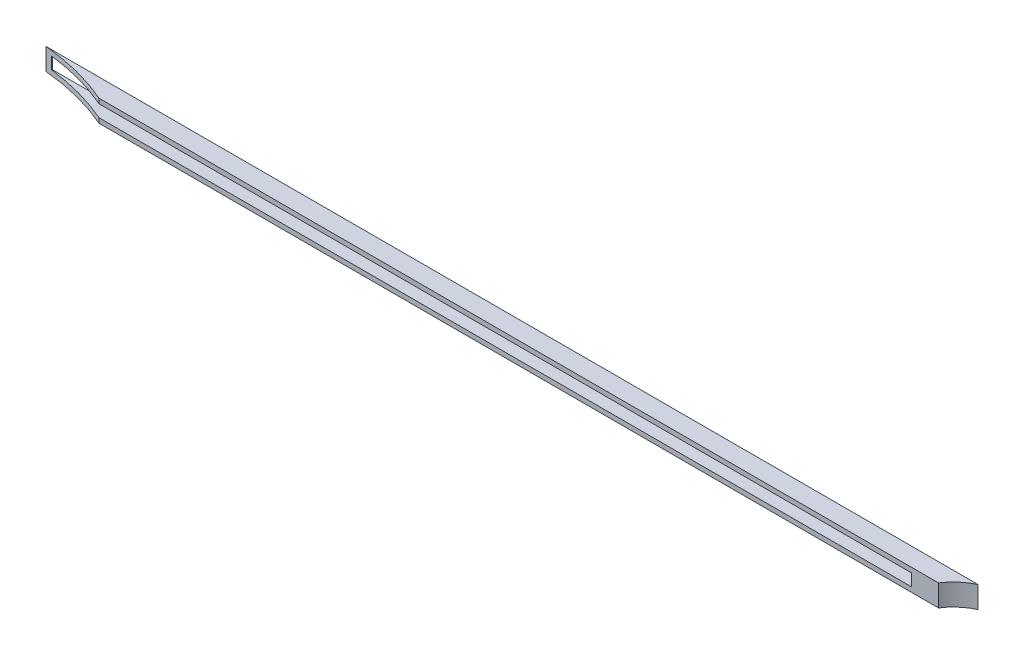
ISO-10303-21;
HEADER;
FILE_DESCRIPTION(('STEP AP214'),'2;1');
FILE_NAME('part.step','',(''),(''),'','','');
FILE_SCHEMA(('AUTOMOTIVE_DESIGN { 1 0 10303 214 1 1 1 1 }'));
ENDSEC;
DATA;
#1=APPLICATION_CONTEXT('core data for automotive mechanical design processes');
#2=APPLICATION_PROTOCOL_DEFINITION('international standard','automotive_design',2000,#1);
#3=PRODUCT_CONTEXT('',#1,'mechanical');
#4=PRODUCT('Part','Part','',(#3));
#5=PRODUCT_RELATED_PRODUCT_CATEGORY('part','',(#4));
#6=PRODUCT_DEFINITION_FORMATION('','',#4);
#7=PRODUCT_DEFINITION_CONTEXT('part definition',#1,'design');
#8=PRODUCT_DEFINITION('design','',#6,#7);
#9=PRODUCT_DEFINITION_SHAPE('','',#8);
#10=(LENGTH_UNIT() NAMED_UNIT(*) SI_UNIT(.MILLI.,.METRE.));
#11=(NAMED_UNIT(*) PLANE_ANGLE_UNIT() SI_UNIT($,.RADIAN.));
#12=(NAMED_UNIT(*) SI_UNIT($,.STERADIAN.) SOLID_ANGLE_UNIT());
#13=UNCERTAINTY_MEASURE_WITH_UNIT(LENGTH_MEASURE(1.E-05),#10,'distance_accuracy_value','');
#14=(GEOMETRIC_REPRESENTATION_CONTEXT(3) GLOBAL_UNCERTAINTY_ASSIGNED_CONTEXT((#13)) GLOBAL_UNIT_ASSIGNED_CONTEXT((#10,
#11,#12)) REPRESENTATION_CONTEXT('',''));
#15=CARTESIAN_POINT('',(0.,0.,0.));
#16=DIRECTION('',(0.,0.,1.));
#17=DIRECTION('',(1.,0.,0.));
#18=AXIS2_PLACEMENT_3D('',#15,#16,#17);
#19=CARTESIAN_POINT('',(0.,0.,9.652));
#20=DIRECTION('',(0.,0.,1.));
#21=DIRECTION('',(1.,0.,0.));
#22=AXIS2_PLACEMENT_3D('',#19,#20,#21);
#23=PLANE('',#22);
#24=DIRECTION('',(0.,1.,0.));
#25=VECTOR('',#24,1.);
#26=CARTESIAN_POINT('',(-196.5963629876,-5.715,9.65199999999999));
#27=LINE('',#26,#25);
#28=CARTESIAN_POINT('',(-196.5963629876,-5.715,9.65199999999999));
#29=VERTEX_POINT('',#28);
#30=CARTESIAN_POINT('',(-196.5963629876,-3.17499999999991,9.65199999999999));
#31=VERTEX_POINT('',#30);
#32=EDGE_CURVE('E61',#29,#31,#27,.T.);
#33=ORIENTED_EDGE('',*,*,#32,.F.);
#34=DIRECTION('',(1.,0.,0.));
#35=VECTOR('',#34,1.);
#36=CARTESIAN_POINT('',(-256.203701079,-5.715,9.652));
#37=LINE('',#36,#35);
#38=CARTESIAN_POINT('',(245.072777915977,-5.715,9.652));
#39=VERTEX_POINT('',#38);
#40=EDGE_CURVE('E47',#29,#39,#37,.T.);
#41=ORIENTED_EDGE('',*,*,#40,.T.);
#42=DIRECTION('',(0.,1.,0.));
#43=VECTOR('',#42,1.);
#44=CARTESIAN_POINT('',(245.072777915977,-5.715,9.652));
#45=LINE('',#44,#43);
#46=CARTESIAN_POINT('',(245.072777915977,5.715,9.652));
#47=VERTEX_POINT('',#46);
#48=EDGE_CURVE('E54',#47,#39,#45,.F.);
#49=ORIENTED_EDGE('',*,*,#48,.F.);
#50=DIRECTION('',(-1.,0.,0.));
#51=VECTOR('',#50,1.);
#52=CARTESIAN_POINT('',(-256.203701079,5.715,9.652));
#53=LINE('',#52,#51);
#54=CARTESIAN_POINT('',(-196.5963629876,5.715,9.65199999999999));
#55=VERTEX_POINT('',#54);
#56=EDGE_CURVE('E127',#47,#55,#53,.T.);
#57=ORIENTED_EDGE('',*,*,#56,.T.);
#58=CARTESIAN_POINT('',(-196.5963629876,3.17499999999988,9.65199999999999));
#59=VERTEX_POINT('',#58);
#60=EDGE_CURVE('E124',#59,#55,#27,.T.);
#61=ORIENTED_EDGE('',*,*,#60,.F.);
#62=DIRECTION('',(-1.,0.,0.));
#63=VECTOR('',#62,1.);
#64=CARTESIAN_POINT('',(-230.803701079,3.17499999999986,9.652));
#65=LINE('',#64,#63);
#66=CARTESIAN_POINT('',(230.80370107902,3.17500000000014,9.652));
#67=VERTEX_POINT('',#66);
#68=EDGE_CURVE('E158',#67,#59,#65,.T.);
#69=ORIENTED_EDGE('',*,*,#68,.F.);
#70=DIRECTION('',(0.,1.,0.));
#71=VECTOR('',#70,1.);
#72=CARTESIAN_POINT('',(230.80370107902,3.17500000000014,9.652));
#73=LINE('',#72,#71);
#74=CARTESIAN_POINT('',(230.80370107902,-3.17499999999986,9.652));
#75=VERTEX_POINT('',#74);
#76=EDGE_CURVE('E156',#75,#67,#73,.T.);
#77=ORIENTED_EDGE('',*,*,#76,.F.);
#78=DIRECTION('',(1.,0.,0.));
#79=VECTOR('',#78,1.);
#80=CARTESIAN_POINT('',(-230.803701079,-3.17499999999991,9.652));
#81=LINE('',#80,#79);
#82=EDGE_CURVE('E122',#31,#75,#81,.T.);
#83=ORIENTED_EDGE('',*,*,#82,.F.);
#84=EDGE_LOOP('',(#33,#41,#49,#57,#61,#69,#77,#83));
#85=FACE_BOUND('',#84,.T.);
#86=ADVANCED_FACE('F39',(#85),#23,.T.);
#87=CARTESIAN_POINT('',(0.,0.,0.));
#88=DIRECTION('',(0.,0.,1.));
#89=DIRECTION('',(1.,0.,0.));
#90=AXIS2_PLACEMENT_3D('',#87,#88,#89);
#91=PLANE('',#90);
#92=DIRECTION('',(1.,0.,0.));
#93=VECTOR('',#92,1.);
#94=CARTESIAN_POINT('',(-256.203701079,-5.715,0.));
#95=LINE('',#94,#93);
#96=CARTESIAN_POINT('',(-234.164594235986,-5.715,0.));
#97=VERTEX_POINT('',#96);
#98=CARTESIAN_POINT('',(256.203701079,-5.715,0.));
#99=VERTEX_POINT('',#98);
#100=EDGE_CURVE('E130',#97,#99,#95,.T.);
#101=ORIENTED_EDGE('',*,*,#100,.F.);
#102=DIRECTION('',(0.,1.,0.));
#103=VECTOR('',#102,1.);
#104=CARTESIAN_POINT('',(-234.164594235986,-5.715,0.));
#105=LINE('',#104,#103);
#106=CARTESIAN_POINT('',(-234.164594235986,5.715,0.));
#107=VERTEX_POINT('',#106);
#108=EDGE_CURVE('E110',#97,#107,#105,.T.);
#109=ORIENTED_EDGE('',*,*,#108,.T.);
#110=DIRECTION('',(-1.,0.,0.));
#111=VECTOR('',#110,1.);
#112=CARTESIAN_POINT('',(-256.203701079,5.715,0.));
#113=LINE('',#112,#111);
#114=CARTESIAN_POINT('',(256.203701079,5.715,0.));
#115=VERTEX_POINT('',#114);
#116=EDGE_CURVE('E136',#115,#107,#113,.T.);
#117=ORIENTED_EDGE('',*,*,#116,.F.);
#118=DIRECTION('',(0.,1.,0.));
#119=VECTOR('',#118,1.);
#120=CARTESIAN_POINT('',(256.203701079,5.715,0.));
#121=LINE('',#120,#119);
#122=EDGE_CURVE('E134',#99,#115,#121,.T.);
#123=ORIENTED_EDGE('',*,*,#122,.F.);
#124=EDGE_LOOP('',(#101,#109,#117,#123));
#125=FACE_BOUND('',#124,.T.);
#126=DIRECTION('',(0.,1.,0.));
#127=VECTOR('',#126,1.);
#128=CARTESIAN_POINT('',(230.80370107902,3.17500000000014,0.));
#129=LINE('',#128,#127);
#130=CARTESIAN_POINT('',(230.80370107902,-3.17499999999986,0.));
#131=VERTEX_POINT('',#130);
#132=CARTESIAN_POINT('',(230.80370107902,3.17500000000014,0.));
#133=VERTEX_POINT('',#132);
#134=EDGE_CURVE('E151',#131,#133,#129,.T.);
#135=ORIENTED_EDGE('',*,*,#134,.T.);
#136=DIRECTION('',(-1.,0.,0.));
#137=VECTOR('',#136,1.);
#138=CARTESIAN_POINT('',(-230.803701079,3.17499999999986,0.));
#139=LINE('',#138,#137);
#140=CARTESIAN_POINT('',(-230.803701079,3.17499999999986,0.));
#141=VERTEX_POINT('',#140);
#142=EDGE_CURVE('E166',#133,#141,#139,.T.);
#143=ORIENTED_EDGE('',*,*,#142,.T.);
#144=DIRECTION('',(0.,-1.,0.));
#145=VECTOR('',#144,1.);
#146=CARTESIAN_POINT('',(-230.803701079,3.17499999999986,0.));
#147=LINE('',#146,#145);
#148=CARTESIAN_POINT('',(-230.803701079,-3.17499999999991,0.));
#149=VERTEX_POINT('',#148);
#150=EDGE_CURVE('E169',#141,#149,#147,.T.);
#151=ORIENTED_EDGE('',*,*,#150,.T.);
#152=DIRECTION('',(1.,0.,0.));
#153=VECTOR('',#152,1.);
#154=CARTESIAN_POINT('',(-230.803701079,-3.17499999999991,0.));
#155=LINE('',#154,#153);
#156=EDGE_CURVE('E159',#149,#131,#155,.T.);
#157=ORIENTED_EDGE('',*,*,#156,.T.);
#158=EDGE_LOOP('',(#135,#143,#151,#157));
#159=FACE_BOUND('',#158,.T.);
#160=ADVANCED_FACE('F142',(#125,#159),#91,.F.);
#161=CARTESIAN_POINT('',(-256.203701079,5.715,9.652));
#162=DIRECTION('',(0.,-1.,0.));
#163=DIRECTION('',(0.,0.,-1.));
#164=AXIS2_PLACEMENT_3D('',#161,#162,#163);
#165=PLANE('',#164);
#166=ORIENTED_EDGE('',*,*,#116,.T.);
#167=CARTESIAN_POINT('',(-245.184147657493,5.715,120.830054160717));
#168=DIRECTION('',(0.,-1.,0.));
#169=DIRECTION('',(0.,0.,-1.));
#170=AXIS2_PLACEMENT_3D('',#167,#168,#169);
#171=CIRCLE('',#170,121.3314985735);
#172=EDGE_CURVE('E123',#107,#55,#171,.T.);
#173=ORIENTED_EDGE('',*,*,#172,.T.);
#174=ORIENTED_EDGE('',*,*,#56,.F.);
#175=CARTESIAN_POINT('',(267.338172934062,5.715,24.0847728874941));
#176=DIRECTION('',(0.,-1.,0.));
#177=DIRECTION('',(0.,0.,-1.));
#178=AXIS2_PLACEMENT_3D('',#175,#176,#177);
#179=CIRCLE('',#178,26.5339923218001);
#180=EDGE_CURVE('E146',#47,#115,#179,.T.);
#181=ORIENTED_EDGE('',*,*,#180,.T.);
#182=EDGE_LOOP('',(#166,#173,#174,#181));
#183=FACE_BOUND('',#182,.T.);
#184=ADVANCED_FACE('F41',(#183),#165,.F.);
#185=CARTESIAN_POINT('',(-256.203701079,-5.715,9.652));
#186=DIRECTION('',(0.,1.,0.));
#187=DIRECTION('',(0.,0.,1.));
#188=AXIS2_PLACEMENT_3D('',#185,#186,#187);
#189=PLANE('',#188);
#190=ORIENTED_EDGE('',*,*,#40,.F.);
#191=CARTESIAN_POINT('',(-245.184147657493,-5.715,120.830054160717));
#192=DIRECTION('',(0.,1.,0.));
#193=DIRECTION('',(0.,0.,1.));
#194=AXIS2_PLACEMENT_3D('',#191,#192,#193);
#195=CIRCLE('',#194,121.3314985735);
#196=EDGE_CURVE('E107',#29,#97,#195,.T.);
#197=ORIENTED_EDGE('',*,*,#196,.T.);
#198=ORIENTED_EDGE('',*,*,#100,.T.);
#199=CARTESIAN_POINT('',(267.338172934062,-5.715,24.0847728874941));
#200=DIRECTION('',(0.,1.,0.));
#201=DIRECTION('',(0.,0.,1.));
#202=AXIS2_PLACEMENT_3D('',#199,#200,#201);
#203=CIRCLE('',#202,26.5339923218001);
#204=EDGE_CURVE('E116',#99,#39,#203,.T.);
#205=ORIENTED_EDGE('',*,*,#204,.T.);
#206=EDGE_LOOP('',(#190,#197,#198,#205));
#207=FACE_BOUND('',#206,.T.);
#208=ADVANCED_FACE('F126',(#207),#189,.F.);
#209=CARTESIAN_POINT('',(230.80370107902,3.17500000000014,9.652));
#210=DIRECTION('',(-1.,0.,0.));
#211=DIRECTION('',(0.,0.,1.));
#212=AXIS2_PLACEMENT_3D('',#209,#210,#211);
#213=PLANE('',#212);
#214=ORIENTED_EDGE('',*,*,#134,.F.);
#215=DIRECTION('',(0.,0.,-1.));
#216=VECTOR('',#215,1.);
#217=CARTESIAN_POINT('',(230.80370107902,-3.17499999999986,9.652));
#218=LINE('',#217,#216);
#219=EDGE_CURVE('E163',#75,#131,#218,.T.);
#220=ORIENTED_EDGE('',*,*,#219,.F.);
#221=ORIENTED_EDGE('',*,*,#76,.T.);
#222=DIRECTION('',(0.,0.,-1.));
#223=VECTOR('',#222,1.);
#224=CARTESIAN_POINT('',(230.80370107902,3.17500000000014,9.652));
#225=LINE('',#224,#223);
#226=EDGE_CURVE('E137',#67,#133,#225,.T.);
#227=ORIENTED_EDGE('',*,*,#226,.T.);
#228=EDGE_LOOP('',(#214,#220,#221,#227));
#229=FACE_BOUND('',#228,.T.);
#230=ADVANCED_FACE('F182',(#229),#213,.T.);
#231=CARTESIAN_POINT('',(-230.803701079,3.17499999999986,9.652));
#232=DIRECTION('',(0.,-1.,0.));
#233=DIRECTION('',(1.,0.,0.));
#234=AXIS2_PLACEMENT_3D('',#231,#232,#233);
#235=PLANE('',#234);
#236=CARTESIAN_POINT('',(-245.184147657493,3.17499999999985,120.830054160717));
#237=DIRECTION('',(0.,-1.,0.));
#238=DIRECTION('',(1.,0.,0.));
#239=AXIS2_PLACEMENT_3D('',#236,#237,#238);
#240=CIRCLE('',#239,121.3314985735);
#241=CARTESIAN_POINT('',(-230.803701079,3.17499999999986,0.353768932899831));
#242=VERTEX_POINT('',#241);
#243=EDGE_CURVE('E194',#242,#59,#240,.T.);
#244=ORIENTED_EDGE('',*,*,#243,.F.);
#245=DIRECTION('',(0.,0.,-1.));
#246=VECTOR('',#245,1.);
#247=CARTESIAN_POINT('',(-230.803701079,3.17499999999986,9.652));
#248=LINE('',#247,#246);
#249=EDGE_CURVE('E178',#242,#141,#248,.T.);
#250=ORIENTED_EDGE('',*,*,#249,.T.);
#251=ORIENTED_EDGE('',*,*,#142,.F.);
#252=ORIENTED_EDGE('',*,*,#226,.F.);
#253=ORIENTED_EDGE('',*,*,#68,.T.);
#254=EDGE_LOOP('',(#244,#250,#251,#252,#253));
#255=FACE_BOUND('',#254,.T.);
#256=ADVANCED_FACE('F193',(#255),#235,.T.);
#257=CARTESIAN_POINT('',(-230.803701079,3.17499999999986,9.652));
#258=DIRECTION('',(1.,0.,0.));
#259=DIRECTION('',(0.,0.,-1.));
#260=AXIS2_PLACEMENT_3D('',#257,#258,#259);
#261=PLANE('',#260);
#262=DIRECTION('',(0.,1.,0.));
#263=VECTOR('',#262,1.);
#264=CARTESIAN_POINT('',(-230.803701079,-5.715,0.353768932899831));
#265=LINE('',#264,#263);
#266=CARTESIAN_POINT('',(-230.803701079,-3.17499999999991,0.353768932899831));
#267=VERTEX_POINT('',#266);
#268=EDGE_CURVE('E115',#267,#242,#265,.T.);
#269=ORIENTED_EDGE('',*,*,#268,.F.);
#270=DIRECTION('',(0.,0.,-1.));
#271=VECTOR('',#270,1.);
#272=CARTESIAN_POINT('',(-230.803701079,-3.17499999999991,9.652));
#273=LINE('',#272,#271);
#274=EDGE_CURVE('E176',#267,#149,#273,.T.);
#275=ORIENTED_EDGE('',*,*,#274,.T.);
#276=ORIENTED_EDGE('',*,*,#150,.F.);
#277=ORIENTED_EDGE('',*,*,#249,.F.);
#278=EDGE_LOOP('',(#269,#275,#276,#277));
#279=FACE_BOUND('',#278,.T.);
#280=ADVANCED_FACE('F199',(#279),#261,.T.);
#281=CARTESIAN_POINT('',(-230.803701079,-3.17499999999991,9.652));
#282=DIRECTION('',(0.,1.,0.));
#283=DIRECTION('',(-1.,0.,0.));
#284=AXIS2_PLACEMENT_3D('',#281,#282,#283);
#285=PLANE('',#284);
#286=CARTESIAN_POINT('',(-245.184147657493,-3.17499999999991,120.830054160717));
#287=DIRECTION('',(0.,1.,0.));
#288=DIRECTION('',(-1.,0.,0.));
#289=AXIS2_PLACEMENT_3D('',#286,#287,#288);
#290=CIRCLE('',#289,121.3314985735);
#291=EDGE_CURVE('E11',#31,#267,#290,.T.);
#292=ORIENTED_EDGE('',*,*,#291,.F.);
#293=ORIENTED_EDGE('',*,*,#82,.T.);
#294=ORIENTED_EDGE('',*,*,#219,.T.);
#295=ORIENTED_EDGE('',*,*,#156,.F.);
#296=ORIENTED_EDGE('',*,*,#274,.F.);
#297=EDGE_LOOP('',(#292,#293,#294,#295,#296));
#298=FACE_BOUND('',#297,.T.);
#299=ADVANCED_FACE('F190',(#298),#285,.T.);
#300=CARTESIAN_POINT('',(-245.184147657493,-5.715,120.830054160717));
#301=DIRECTION('',(0.,1.,0.));
#302=DIRECTION('',(0.,0.,1.));
#303=AXIS2_PLACEMENT_3D('',#300,#301,#302);
#304=CYLINDRICAL_SURFACE('',#303,121.3314985735);
#305=ORIENTED_EDGE('',*,*,#196,.F.);
#306=ORIENTED_EDGE('',*,*,#32,.T.);
#307=ORIENTED_EDGE('',*,*,#291,.T.);
#308=ORIENTED_EDGE('',*,*,#268,.T.);
#309=ORIENTED_EDGE('',*,*,#243,.T.);
#310=ORIENTED_EDGE('',*,*,#60,.T.);
#311=ORIENTED_EDGE('',*,*,#172,.F.);
#312=ORIENTED_EDGE('',*,*,#108,.F.);
#313=EDGE_LOOP('',(#305,#306,#307,#308,#309,#310,#311,#312));
#314=FACE_BOUND('',#313,.T.);
#315=ADVANCED_FACE('F108',(#314),#304,.F.);
#316=CARTESIAN_POINT('',(267.338172934062,-5.715,24.0847728874941));
#317=DIRECTION('',(0.,1.,0.));
#318=DIRECTION('',(0.,0.,1.));
#319=AXIS2_PLACEMENT_3D('',#316,#317,#318);
#320=CYLINDRICAL_SURFACE('',#319,26.5339923218001);
#321=ORIENTED_EDGE('',*,*,#48,.T.);
#322=ORIENTED_EDGE('',*,*,#204,.F.);
#323=ORIENTED_EDGE('',*,*,#122,.T.);
#324=ORIENTED_EDGE('',*,*,#180,.F.);
#325=EDGE_LOOP('',(#321,#322,#323,#324));
#326=FACE_BOUND('',#325,.T.);
#327=ADVANCED_FACE('F145',(#326),#320,.F.);
#328=CLOSED_SHELL('',(#86,#160,#184,#208,#230,#256,#280,#299,#315,#327));
#329=MANIFOLD_SOLID_BREP('B2',#328);
#330=ADVANCED_BREP_SHAPE_REPRESENTATION('',(#18,#329),#14);
#331=SHAPE_DEFINITION_REPRESENTATION(#9,#330);
ENDSEC;
END-ISO-10303-21;
